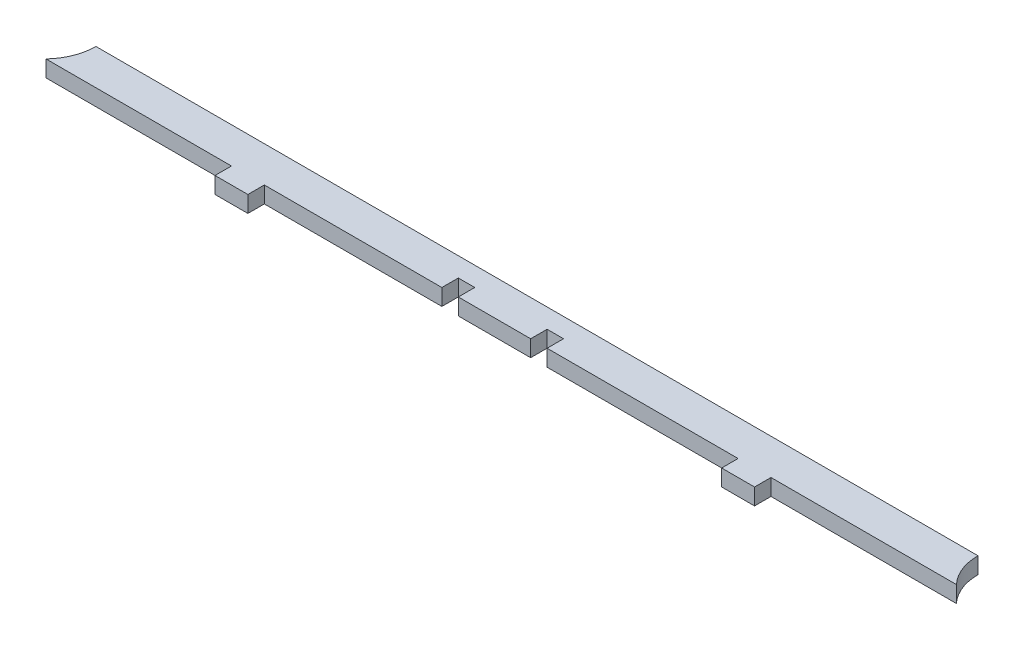
ISO-10303-21;
HEADER;
FILE_DESCRIPTION(('STEP AP214'),'2;1');
FILE_NAME('part.step','',(''),(''),'','','');
FILE_SCHEMA(('AUTOMOTIVE_DESIGN { 1 0 10303 214 1 1 1 1 }'));
ENDSEC;
DATA;
#1=APPLICATION_CONTEXT('core data for automotive mechanical design processes');
#2=APPLICATION_PROTOCOL_DEFINITION('international standard','automotive_design',2000,#1);
#3=PRODUCT_CONTEXT('',#1,'mechanical');
#4=PRODUCT('Part','Part','',(#3));
#5=PRODUCT_RELATED_PRODUCT_CATEGORY('part','',(#4));
#6=PRODUCT_DEFINITION_FORMATION('','',#4);
#7=PRODUCT_DEFINITION_CONTEXT('part definition',#1,'design');
#8=PRODUCT_DEFINITION('design','',#6,#7);
#9=PRODUCT_DEFINITION_SHAPE('','',#8);
#10=(LENGTH_UNIT() NAMED_UNIT(*) SI_UNIT(.MILLI.,.METRE.));
#11=(NAMED_UNIT(*) PLANE_ANGLE_UNIT() SI_UNIT($,.RADIAN.));
#12=(NAMED_UNIT(*) SI_UNIT($,.STERADIAN.) SOLID_ANGLE_UNIT());
#13=UNCERTAINTY_MEASURE_WITH_UNIT(LENGTH_MEASURE(1.E-05),#10,'distance_accuracy_value','');
#14=(GEOMETRIC_REPRESENTATION_CONTEXT(3) GLOBAL_UNCERTAINTY_ASSIGNED_CONTEXT((#13)) GLOBAL_UNIT_ASSIGNED_CONTEXT((#10,
#11,#12)) REPRESENTATION_CONTEXT('',''));
#15=CARTESIAN_POINT('',(0.,0.,0.));
#16=DIRECTION('',(0.,0.,1.));
#17=DIRECTION('',(1.,0.,0.));
#18=AXIS2_PLACEMENT_3D('',#15,#16,#17);
#19=CARTESIAN_POINT('',(0.,2.5,10.875));
#20=DIRECTION('',(0.,0.,1.));
#21=DIRECTION('',(1.,0.,0.));
#22=AXIS2_PLACEMENT_3D('',#19,#20,#21);
#23=PLANE('',#22);
#24=DIRECTION('',(0.,1.,0.));
#25=VECTOR('',#24,1.);
#26=CARTESIAN_POINT('',(13.9550335062204,-2.501,10.875));
#27=LINE('',#26,#25);
#28=CARTESIAN_POINT('',(13.9550335062204,-2.5,10.875));
#29=VERTEX_POINT('',#28);
#30=CARTESIAN_POINT('',(13.9550335062204,2.5,10.875));
#31=VERTEX_POINT('',#30);
#32=EDGE_CURVE('E212',#29,#31,#27,.T.);
#33=ORIENTED_EDGE('',*,*,#32,.F.);
#34=DIRECTION('',(-1.,0.,0.));
#35=VECTOR('',#34,1.);
#36=CARTESIAN_POINT('',(0.,-2.5,10.875));
#37=LINE('',#36,#35);
#38=CARTESIAN_POINT('',(72.04,-2.5,10.875));
#39=VERTEX_POINT('',#38);
#40=EDGE_CURVE('E273',#39,#29,#37,.T.);
#41=ORIENTED_EDGE('',*,*,#40,.F.);
#42=DIRECTION('',(0.,-1.,0.));
#43=VECTOR('',#42,1.);
#44=CARTESIAN_POINT('',(72.04,2.5,10.875));
#45=LINE('',#44,#43);
#46=CARTESIAN_POINT('',(72.04,2.5,10.875));
#47=VERTEX_POINT('',#46);
#48=EDGE_CURVE('E308',#47,#39,#45,.T.);
#49=ORIENTED_EDGE('',*,*,#48,.F.);
#50=DIRECTION('',(-1.,0.,0.));
#51=VECTOR('',#50,1.);
#52=CARTESIAN_POINT('',(0.,2.5,10.875));
#53=LINE('',#52,#51);
#54=EDGE_CURVE('E244',#47,#31,#53,.T.);
#55=ORIENTED_EDGE('',*,*,#54,.T.);
#56=EDGE_LOOP('',(#33,#41,#49,#55));
#57=FACE_BOUND('',#56,.T.);
#58=ADVANCED_FACE('F41',(#57),#23,.T.);
#59=DIRECTION('',(0.,1.,0.));
#60=VECTOR('',#59,1.);
#61=CARTESIAN_POINT('',(8.95503350622037,-2.501,10.875));
#62=LINE('',#61,#60);
#63=CARTESIAN_POINT('',(8.95503350622037,-2.5,10.875));
#64=VERTEX_POINT('',#63);
#65=CARTESIAN_POINT('',(8.95503350622037,2.5,10.875));
#66=VERTEX_POINT('',#65);
#67=EDGE_CURVE('E64',#64,#66,#62,.T.);
#68=ORIENTED_EDGE('',*,*,#67,.T.);
#69=CARTESIAN_POINT('',(-13.0449664937796,2.5,10.875));
#70=VERTEX_POINT('',#69);
#71=EDGE_CURVE('E432',#66,#70,#53,.T.);
#72=ORIENTED_EDGE('',*,*,#71,.T.);
#73=DIRECTION('',(0.,1.,0.));
#74=VECTOR('',#73,1.);
#75=CARTESIAN_POINT('',(-13.0449664937796,-2.501,10.875));
#76=LINE('',#75,#74);
#77=CARTESIAN_POINT('',(-13.0449664937796,-2.5,10.875));
#78=VERTEX_POINT('',#77);
#79=EDGE_CURVE('E219',#78,#70,#76,.T.);
#80=ORIENTED_EDGE('',*,*,#79,.F.);
#81=EDGE_CURVE('E344',#64,#78,#37,.T.);
#82=ORIENTED_EDGE('',*,*,#81,.F.);
#83=EDGE_LOOP('',(#68,#72,#80,#82));
#84=FACE_BOUND('',#83,.T.);
#85=ADVANCED_FACE('F374',(#84),#23,.T.);
#86=CARTESIAN_POINT('',(-18.0449664937796,-2.5,10.875));
#87=VERTEX_POINT('',#86);
#88=CARTESIAN_POINT('',(-72.04,-2.5,10.875));
#89=VERTEX_POINT('',#88);
#90=EDGE_CURVE('E272',#87,#89,#37,.T.);
#91=ORIENTED_EDGE('',*,*,#90,.F.);
#92=DIRECTION('',(0.,1.,0.));
#93=VECTOR('',#92,1.);
#94=CARTESIAN_POINT('',(-18.0449664937796,-2.501,10.875));
#95=LINE('',#94,#93);
#96=CARTESIAN_POINT('',(-18.0449664937796,2.5,10.875));
#97=VERTEX_POINT('',#96);
#98=EDGE_CURVE('E56',#87,#97,#95,.T.);
#99=ORIENTED_EDGE('',*,*,#98,.T.);
#100=CARTESIAN_POINT('',(-72.04,2.5,10.875));
#101=VERTEX_POINT('',#100);
#102=EDGE_CURVE('E243',#97,#101,#53,.T.);
#103=ORIENTED_EDGE('',*,*,#102,.T.);
#104=DIRECTION('',(0.,-1.,0.));
#105=VECTOR('',#104,1.);
#106=CARTESIAN_POINT('',(-72.04,2.5,10.875));
#107=LINE('',#106,#105);
#108=EDGE_CURVE('E310',#101,#89,#107,.T.);
#109=ORIENTED_EDGE('',*,*,#108,.T.);
#110=EDGE_LOOP('',(#91,#99,#103,#109));
#111=FACE_BOUND('',#110,.T.);
#112=ADVANCED_FACE('F349',(#111),#23,.T.);
#113=CARTESIAN_POINT('',(0.,2.5,0.));
#114=DIRECTION('',(0.,1.,0.));
#115=DIRECTION('',(0.,0.,1.));
#116=AXIS2_PLACEMENT_3D('',#113,#114,#115);
#117=PLANE('',#116);
#118=DIRECTION('',(0.,0.,-1.));
#119=VECTOR('',#118,1.);
#120=CARTESIAN_POINT('',(13.9550335062204,2.5,10.875));
#121=LINE('',#120,#119);
#122=CARTESIAN_POINT('',(13.9550335062204,2.5,5.87500000000002));
#123=VERTEX_POINT('',#122);
#124=EDGE_CURVE('E186',#31,#123,#121,.T.);
#125=ORIENTED_EDGE('',*,*,#124,.F.);
#126=ORIENTED_EDGE('',*,*,#54,.F.);
#127=DIRECTION('',(0.,0.,1.));
#128=VECTOR('',#127,1.);
#129=CARTESIAN_POINT('',(72.04,2.5,0.));
#130=LINE('',#129,#128);
#131=CARTESIAN_POINT('',(72.04,2.5,15.875));
#132=VERTEX_POINT('',#131);
#133=EDGE_CURVE('E252',#47,#132,#130,.T.);
#134=ORIENTED_EDGE('',*,*,#133,.T.);
#135=DIRECTION('',(1.,0.,0.));
#136=VECTOR('',#135,1.);
#137=CARTESIAN_POINT('',(0.,2.5,15.875));
#138=LINE('',#137,#136);
#139=CARTESIAN_POINT('',(82.04,2.5,15.875));
#140=VERTEX_POINT('',#139);
#141=EDGE_CURVE('E254',#132,#140,#138,.T.);
#142=ORIENTED_EDGE('',*,*,#141,.T.);
#143=DIRECTION('',(0.,0.,1.));
#144=VECTOR('',#143,1.);
#145=CARTESIAN_POINT('',(82.04,2.5,0.));
#146=LINE('',#145,#144);
#147=CARTESIAN_POINT('',(82.04,2.5,10.875));
#148=VERTEX_POINT('',#147);
#149=EDGE_CURVE('E256',#148,#140,#146,.T.);
#150=ORIENTED_EDGE('',*,*,#149,.F.);
#151=CARTESIAN_POINT('',(138.43496649378,2.5,10.875));
#152=VERTEX_POINT('',#151);
#153=EDGE_CURVE('E259',#152,#148,#53,.T.);
#154=ORIENTED_EDGE('',*,*,#153,.F.);
#155=CARTESIAN_POINT('',(150.,2.5,0.));
#156=DIRECTION('',(0.,1.,0.));
#157=DIRECTION('',(0.,0.,1.));
#158=AXIS2_PLACEMENT_3D('',#155,#156,#157);
#159=CIRCLE('',#158,15.875);
#160=CARTESIAN_POINT('',(134.125,2.5,0.));
#161=VERTEX_POINT('',#160);
#162=EDGE_CURVE('E260',#161,#152,#159,.T.);
#163=ORIENTED_EDGE('',*,*,#162,.F.);
#164=DIRECTION('',(-1.,0.,0.));
#165=VECTOR('',#164,1.);
#166=CARTESIAN_POINT('',(0.,2.5,0.));
#167=LINE('',#166,#165);
#168=CARTESIAN_POINT('',(-134.125,2.5,0.));
#169=VERTEX_POINT('',#168);
#170=EDGE_CURVE('E263',#161,#169,#167,.T.);
#171=ORIENTED_EDGE('',*,*,#170,.T.);
#172=CARTESIAN_POINT('',(-150.,2.5,0.));
#173=DIRECTION('',(0.,1.,0.));
#174=DIRECTION('',(0.,0.,1.));
#175=AXIS2_PLACEMENT_3D('',#172,#173,#174);
#176=CIRCLE('',#175,15.875);
#177=CARTESIAN_POINT('',(-138.43496649378,2.5,10.8750000000001));
#178=VERTEX_POINT('',#177);
#179=EDGE_CURVE('E235',#178,#169,#176,.T.);
#180=ORIENTED_EDGE('',*,*,#179,.F.);
#181=CARTESIAN_POINT('',(-82.04,2.5,10.875));
#182=VERTEX_POINT('',#181);
#183=EDGE_CURVE('E238',#182,#178,#53,.T.);
#184=ORIENTED_EDGE('',*,*,#183,.F.);
#185=DIRECTION('',(0.,0.,1.));
#186=VECTOR('',#185,1.);
#187=CARTESIAN_POINT('',(-82.04,2.5,0.));
#188=LINE('',#187,#186);
#189=CARTESIAN_POINT('',(-82.04,2.5,15.875));
#190=VERTEX_POINT('',#189);
#191=EDGE_CURVE('E242',#182,#190,#188,.T.);
#192=ORIENTED_EDGE('',*,*,#191,.T.);
#193=DIRECTION('',(-1.,0.,0.));
#194=VECTOR('',#193,1.);
#195=CARTESIAN_POINT('',(0.,2.5,15.875));
#196=LINE('',#195,#194);
#197=CARTESIAN_POINT('',(-72.04,2.5,15.875));
#198=VERTEX_POINT('',#197);
#199=EDGE_CURVE('E246',#198,#190,#196,.T.);
#200=ORIENTED_EDGE('',*,*,#199,.F.);
#201=DIRECTION('',(0.,0.,1.));
#202=VECTOR('',#201,1.);
#203=CARTESIAN_POINT('',(-72.04,2.5,-1.99951166734991E-13));
#204=LINE('',#203,#202);
#205=EDGE_CURVE('E249',#101,#198,#204,.T.);
#206=ORIENTED_EDGE('',*,*,#205,.F.);
#207=ORIENTED_EDGE('',*,*,#102,.F.);
#208=DIRECTION('',(0.,0.,-1.));
#209=VECTOR('',#208,1.);
#210=CARTESIAN_POINT('',(-18.0449664937796,2.5,10.875));
#211=LINE('',#210,#209);
#212=CARTESIAN_POINT('',(-18.0449664937796,2.5,5.87500000000002));
#213=VERTEX_POINT('',#212);
#214=EDGE_CURVE('E224',#97,#213,#211,.T.);
#215=ORIENTED_EDGE('',*,*,#214,.T.);
#216=DIRECTION('',(1.,0.,0.));
#217=VECTOR('',#216,1.);
#218=CARTESIAN_POINT('',(-18.0449664937796,2.5,5.87500000000002));
#219=LINE('',#218,#217);
#220=CARTESIAN_POINT('',(-13.0449664937796,2.5,5.87500000000002));
#221=VERTEX_POINT('',#220);
#222=EDGE_CURVE('E230',#213,#221,#219,.T.);
#223=ORIENTED_EDGE('',*,*,#222,.T.);
#224=DIRECTION('',(0.,0.,1.));
#225=VECTOR('',#224,1.);
#226=CARTESIAN_POINT('',(-13.0449664937796,2.5,5.87500000000002));
#227=LINE('',#226,#225);
#228=EDGE_CURVE('E227',#221,#70,#227,.T.);
#229=ORIENTED_EDGE('',*,*,#228,.T.);
#230=ORIENTED_EDGE('',*,*,#71,.F.);
#231=DIRECTION('',(0.,0.,1.));
#232=VECTOR('',#231,1.);
#233=CARTESIAN_POINT('',(8.95503350622037,2.5,5.87500000000002));
#234=LINE('',#233,#232);
#235=CARTESIAN_POINT('',(8.95503350622037,2.5,5.87500000000002));
#236=VERTEX_POINT('',#235);
#237=EDGE_CURVE('E207',#236,#66,#234,.T.);
#238=ORIENTED_EDGE('',*,*,#237,.F.);
#239=DIRECTION('',(-1.,0.,0.));
#240=VECTOR('',#239,1.);
#241=CARTESIAN_POINT('',(13.9550335062204,2.5,5.87500000000002));
#242=LINE('',#241,#240);
#243=EDGE_CURVE('E184',#123,#236,#242,.T.);
#244=ORIENTED_EDGE('',*,*,#243,.F.);
#245=EDGE_LOOP('',(#125,#126,#134,#142,#150,#154,#163,#171,#180,#184,#192,#200,#206,#207,#215,
#223,#229,#230,#238,#244));
#246=FACE_BOUND('',#245,.T.);
#247=ADVANCED_FACE('F359',(#246),#117,.T.);
#248=CARTESIAN_POINT('',(0.,-2.5,0.));
#249=DIRECTION('',(0.,1.,0.));
#250=DIRECTION('',(0.,0.,1.));
#251=AXIS2_PLACEMENT_3D('',#248,#249,#250);
#252=PLANE('',#251);
#253=ORIENTED_EDGE('',*,*,#40,.T.);
#254=DIRECTION('',(0.,0.,1.));
#255=VECTOR('',#254,1.);
#256=CARTESIAN_POINT('',(13.9550335062204,-2.5,10.875));
#257=LINE('',#256,#255);
#258=CARTESIAN_POINT('',(13.9550335062204,-2.5,5.87500000000002));
#259=VERTEX_POINT('',#258);
#260=EDGE_CURVE('E198',#259,#29,#257,.T.);
#261=ORIENTED_EDGE('',*,*,#260,.F.);
#262=DIRECTION('',(1.,0.,0.));
#263=VECTOR('',#262,1.);
#264=CARTESIAN_POINT('',(13.9550335062204,-2.5,5.87500000000002));
#265=LINE('',#264,#263);
#266=CARTESIAN_POINT('',(8.95503350622037,-2.5,5.87500000000002));
#267=VERTEX_POINT('',#266);
#268=EDGE_CURVE('E181',#267,#259,#265,.T.);
#269=ORIENTED_EDGE('',*,*,#268,.F.);
#270=DIRECTION('',(0.,0.,-1.));
#271=VECTOR('',#270,1.);
#272=CARTESIAN_POINT('',(8.95503350622037,-2.5,5.87500000000002));
#273=LINE('',#272,#271);
#274=EDGE_CURVE('E188',#64,#267,#273,.T.);
#275=ORIENTED_EDGE('',*,*,#274,.F.);
#276=ORIENTED_EDGE('',*,*,#81,.T.);
#277=DIRECTION('',(0.,0.,-1.));
#278=VECTOR('',#277,1.);
#279=CARTESIAN_POINT('',(-13.0449664937796,-2.5,5.87500000000002));
#280=LINE('',#279,#278);
#281=CARTESIAN_POINT('',(-13.0449664937796,-2.5,5.87500000000002));
#282=VERTEX_POINT('',#281);
#283=EDGE_CURVE('E203',#78,#282,#280,.T.);
#284=ORIENTED_EDGE('',*,*,#283,.T.);
#285=DIRECTION('',(-1.,0.,0.));
#286=VECTOR('',#285,1.);
#287=CARTESIAN_POINT('',(-18.0449664937796,-2.5,5.87500000000002));
#288=LINE('',#287,#286);
#289=CARTESIAN_POINT('',(-18.0449664937796,-2.5,5.87500000000002));
#290=VERTEX_POINT('',#289);
#291=EDGE_CURVE('E199',#282,#290,#288,.T.);
#292=ORIENTED_EDGE('',*,*,#291,.T.);
#293=DIRECTION('',(0.,0.,1.));
#294=VECTOR('',#293,1.);
#295=CARTESIAN_POINT('',(-18.0449664937796,-2.5,10.875));
#296=LINE('',#295,#294);
#297=EDGE_CURVE('E215',#290,#87,#296,.T.);
#298=ORIENTED_EDGE('',*,*,#297,.T.);
#299=ORIENTED_EDGE('',*,*,#90,.T.);
#300=DIRECTION('',(0.,0.,1.));
#301=VECTOR('',#300,1.);
#302=CARTESIAN_POINT('',(-72.04,-2.5,-1.99951166734991E-13));
#303=LINE('',#302,#301);
#304=CARTESIAN_POINT('',(-72.04,-2.5,15.875));
#305=VERTEX_POINT('',#304);
#306=EDGE_CURVE('E279',#89,#305,#303,.T.);
#307=ORIENTED_EDGE('',*,*,#306,.T.);
#308=DIRECTION('',(-1.,0.,0.));
#309=VECTOR('',#308,1.);
#310=CARTESIAN_POINT('',(0.,-2.5,15.875));
#311=LINE('',#310,#309);
#312=CARTESIAN_POINT('',(-82.04,-2.5,15.875));
#313=VERTEX_POINT('',#312);
#314=EDGE_CURVE('E276',#305,#313,#311,.T.);
#315=ORIENTED_EDGE('',*,*,#314,.T.);
#316=DIRECTION('',(0.,0.,1.));
#317=VECTOR('',#316,1.);
#318=CARTESIAN_POINT('',(-82.04,-2.5,0.));
#319=LINE('',#318,#317);
#320=CARTESIAN_POINT('',(-82.04,-2.5,10.875));
#321=VERTEX_POINT('',#320);
#322=EDGE_CURVE('E271',#321,#313,#319,.T.);
#323=ORIENTED_EDGE('',*,*,#322,.F.);
#324=CARTESIAN_POINT('',(-138.43496649378,-2.5,10.8750000000001));
#325=VERTEX_POINT('',#324);
#326=EDGE_CURVE('E268',#321,#325,#37,.T.);
#327=ORIENTED_EDGE('',*,*,#326,.T.);
#328=CARTESIAN_POINT('',(-150.,-2.5,0.));
#329=DIRECTION('',(0.,1.,0.));
#330=DIRECTION('',(0.,0.,1.));
#331=AXIS2_PLACEMENT_3D('',#328,#329,#330);
#332=CIRCLE('',#331,15.875);
#333=CARTESIAN_POINT('',(-134.125,-2.5,0.));
#334=VERTEX_POINT('',#333);
#335=EDGE_CURVE('E193',#325,#334,#332,.T.);
#336=ORIENTED_EDGE('',*,*,#335,.T.);
#337=DIRECTION('',(-1.,0.,0.));
#338=VECTOR('',#337,1.);
#339=CARTESIAN_POINT('',(0.,-2.5,0.));
#340=LINE('',#339,#338);
#341=CARTESIAN_POINT('',(134.125,-2.5,0.));
#342=VERTEX_POINT('',#341);
#343=EDGE_CURVE('E239',#342,#334,#340,.T.);
#344=ORIENTED_EDGE('',*,*,#343,.F.);
#345=CARTESIAN_POINT('',(150.,-2.5,0.));
#346=DIRECTION('',(0.,1.,0.));
#347=DIRECTION('',(0.,0.,1.));
#348=AXIS2_PLACEMENT_3D('',#345,#346,#347);
#349=CIRCLE('',#348,15.875);
#350=CARTESIAN_POINT('',(138.43496649378,-2.5,10.875));
#351=VERTEX_POINT('',#350);
#352=EDGE_CURVE('E291',#342,#351,#349,.T.);
#353=ORIENTED_EDGE('',*,*,#352,.T.);
#354=CARTESIAN_POINT('',(82.04,-2.5,10.875));
#355=VERTEX_POINT('',#354);
#356=EDGE_CURVE('E290',#351,#355,#37,.T.);
#357=ORIENTED_EDGE('',*,*,#356,.T.);
#358=DIRECTION('',(0.,0.,1.));
#359=VECTOR('',#358,1.);
#360=CARTESIAN_POINT('',(82.04,-2.5,0.));
#361=LINE('',#360,#359);
#362=CARTESIAN_POINT('',(82.04,-2.5,15.875));
#363=VERTEX_POINT('',#362);
#364=EDGE_CURVE('E287',#355,#363,#361,.T.);
#365=ORIENTED_EDGE('',*,*,#364,.T.);
#366=DIRECTION('',(1.,0.,0.));
#367=VECTOR('',#366,1.);
#368=CARTESIAN_POINT('',(0.,-2.5,15.875));
#369=LINE('',#368,#367);
#370=CARTESIAN_POINT('',(72.04,-2.5,15.875));
#371=VERTEX_POINT('',#370);
#372=EDGE_CURVE('E284',#371,#363,#369,.T.);
#373=ORIENTED_EDGE('',*,*,#372,.F.);
#374=DIRECTION('',(0.,0.,1.));
#375=VECTOR('',#374,1.);
#376=CARTESIAN_POINT('',(72.04,-2.5,0.));
#377=LINE('',#376,#375);
#378=EDGE_CURVE('E282',#39,#371,#377,.T.);
#379=ORIENTED_EDGE('',*,*,#378,.F.);
#380=EDGE_LOOP('',(#253,#261,#269,#275,#276,#284,#292,#298,#299,#307,#315,#323,#327,#336,#344,
#353,#357,#365,#373,#379));
#381=FACE_BOUND('',#380,.T.);
#382=ADVANCED_FACE('F197',(#381),#252,.F.);
#383=CARTESIAN_POINT('',(-150.,2.5,0.));
#384=DIRECTION('',(0.,-1.,0.));
#385=DIRECTION('',(0.,0.,-1.));
#386=AXIS2_PLACEMENT_3D('',#383,#384,#385);
#387=CYLINDRICAL_SURFACE('',#386,15.875);
#388=ORIENTED_EDGE('',*,*,#335,.F.);
#389=DIRECTION('',(0.,-1.,0.));
#390=VECTOR('',#389,1.);
#391=CARTESIAN_POINT('',(-138.43496649378,2.5,10.8750000000001));
#392=LINE('',#391,#390);
#393=EDGE_CURVE('E11',#178,#325,#392,.T.);
#394=ORIENTED_EDGE('',*,*,#393,.F.);
#395=ORIENTED_EDGE('',*,*,#179,.T.);
#396=DIRECTION('',(0.,-1.,0.));
#397=VECTOR('',#396,1.);
#398=CARTESIAN_POINT('',(-134.125,2.5,0.));
#399=LINE('',#398,#397);
#400=EDGE_CURVE('E265',#169,#334,#399,.T.);
#401=ORIENTED_EDGE('',*,*,#400,.T.);
#402=EDGE_LOOP('',(#388,#394,#395,#401));
#403=FACE_BOUND('',#402,.T.);
#404=ADVANCED_FACE('F43',(#403),#387,.F.);
#405=ORIENTED_EDGE('',*,*,#326,.F.);
#406=DIRECTION('',(0.,-1.,0.));
#407=VECTOR('',#406,1.);
#408=CARTESIAN_POINT('',(-82.04,2.5,10.875));
#409=LINE('',#408,#407);
#410=EDGE_CURVE('E49',#182,#321,#409,.T.);
#411=ORIENTED_EDGE('',*,*,#410,.F.);
#412=ORIENTED_EDGE('',*,*,#183,.T.);
#413=ORIENTED_EDGE('',*,*,#393,.T.);
#414=EDGE_LOOP('',(#405,#411,#412,#413));
#415=FACE_BOUND('',#414,.T.);
#416=ADVANCED_FACE('F325',(#415),#23,.T.);
#417=CARTESIAN_POINT('',(-82.04,2.5,0.));
#418=DIRECTION('',(1.,0.,0.));
#419=DIRECTION('',(0.,0.,-1.));
#420=AXIS2_PLACEMENT_3D('',#417,#418,#419);
#421=PLANE('',#420);
#422=ORIENTED_EDGE('',*,*,#322,.T.);
#423=DIRECTION('',(0.,-1.,0.));
#424=VECTOR('',#423,1.);
#425=CARTESIAN_POINT('',(-82.04,2.5,15.875));
#426=LINE('',#425,#424);
#427=EDGE_CURVE('E315',#190,#313,#426,.T.);
#428=ORIENTED_EDGE('',*,*,#427,.F.);
#429=ORIENTED_EDGE('',*,*,#191,.F.);
#430=ORIENTED_EDGE('',*,*,#410,.T.);
#431=EDGE_LOOP('',(#422,#428,#429,#430));
#432=FACE_BOUND('',#431,.T.);
#433=ADVANCED_FACE('F319',(#432),#421,.F.);
#434=CARTESIAN_POINT('',(0.,2.5,15.875));
#435=DIRECTION('',(0.,0.,1.));
#436=DIRECTION('',(1.,0.,0.));
#437=AXIS2_PLACEMENT_3D('',#434,#435,#436);
#438=PLANE('',#437);
#439=ORIENTED_EDGE('',*,*,#314,.F.);
#440=DIRECTION('',(0.,-1.,0.));
#441=VECTOR('',#440,1.);
#442=CARTESIAN_POINT('',(-72.04,2.5,15.875));
#443=LINE('',#442,#441);
#444=EDGE_CURVE('E313',#198,#305,#443,.T.);
#445=ORIENTED_EDGE('',*,*,#444,.F.);
#446=ORIENTED_EDGE('',*,*,#199,.T.);
#447=ORIENTED_EDGE('',*,*,#427,.T.);
#448=EDGE_LOOP('',(#439,#445,#446,#447));
#449=FACE_BOUND('',#448,.T.);
#450=ADVANCED_FACE('F356',(#449),#438,.T.);
#451=CARTESIAN_POINT('',(-72.04,2.5,-1.99951166734991E-13));
#452=DIRECTION('',(1.,0.,0.));
#453=DIRECTION('',(0.,0.,-1.));
#454=AXIS2_PLACEMENT_3D('',#451,#452,#453);
#455=PLANE('',#454);
#456=ORIENTED_EDGE('',*,*,#306,.F.);
#457=ORIENTED_EDGE('',*,*,#108,.F.);
#458=ORIENTED_EDGE('',*,*,#205,.T.);
#459=ORIENTED_EDGE('',*,*,#444,.T.);
#460=EDGE_LOOP('',(#456,#457,#458,#459));
#461=FACE_BOUND('',#460,.T.);
#462=ADVANCED_FACE('F353',(#461),#455,.T.);
#463=CARTESIAN_POINT('',(72.04,2.5,0.));
#464=DIRECTION('',(1.,0.,0.));
#465=DIRECTION('',(0.,0.,-1.));
#466=AXIS2_PLACEMENT_3D('',#463,#464,#465);
#467=PLANE('',#466);
#468=ORIENTED_EDGE('',*,*,#378,.T.);
#469=DIRECTION('',(0.,-1.,0.));
#470=VECTOR('',#469,1.);
#471=CARTESIAN_POINT('',(72.04,2.5,15.875));
#472=LINE('',#471,#470);
#473=EDGE_CURVE('E305',#132,#371,#472,.T.);
#474=ORIENTED_EDGE('',*,*,#473,.F.);
#475=ORIENTED_EDGE('',*,*,#133,.F.);
#476=ORIENTED_EDGE('',*,*,#48,.T.);
#477=EDGE_LOOP('',(#468,#474,#475,#476));
#478=FACE_BOUND('',#477,.T.);
#479=ADVANCED_FACE('F426',(#478),#467,.F.);
#480=CARTESIAN_POINT('',(0.,2.5,15.875));
#481=DIRECTION('',(0.,0.,-1.));
#482=DIRECTION('',(-1.,0.,0.));
#483=AXIS2_PLACEMENT_3D('',#480,#481,#482);
#484=PLANE('',#483);
#485=ORIENTED_EDGE('',*,*,#372,.T.);
#486=DIRECTION('',(0.,-1.,0.));
#487=VECTOR('',#486,1.);
#488=CARTESIAN_POINT('',(82.04,2.5,15.875));
#489=LINE('',#488,#487);
#490=EDGE_CURVE('E303',#140,#363,#489,.T.);
#491=ORIENTED_EDGE('',*,*,#490,.F.);
#492=ORIENTED_EDGE('',*,*,#141,.F.);
#493=ORIENTED_EDGE('',*,*,#473,.T.);
#494=EDGE_LOOP('',(#485,#491,#492,#493));
#495=FACE_BOUND('',#494,.T.);
#496=ADVANCED_FACE('F388',(#495),#484,.F.);
#497=CARTESIAN_POINT('',(82.04,2.5,0.));
#498=DIRECTION('',(1.,0.,0.));
#499=DIRECTION('',(0.,0.,-1.));
#500=AXIS2_PLACEMENT_3D('',#497,#498,#499);
#501=PLANE('',#500);
#502=ORIENTED_EDGE('',*,*,#364,.F.);
#503=DIRECTION('',(0.,-1.,0.));
#504=VECTOR('',#503,1.);
#505=CARTESIAN_POINT('',(82.04,2.5,10.875));
#506=LINE('',#505,#504);
#507=EDGE_CURVE('E301',#148,#355,#506,.T.);
#508=ORIENTED_EDGE('',*,*,#507,.F.);
#509=ORIENTED_EDGE('',*,*,#149,.T.);
#510=ORIENTED_EDGE('',*,*,#490,.T.);
#511=EDGE_LOOP('',(#502,#508,#509,#510));
#512=FACE_BOUND('',#511,.T.);
#513=ADVANCED_FACE('F384',(#512),#501,.T.);
#514=ORIENTED_EDGE('',*,*,#356,.F.);
#515=DIRECTION('',(0.,-1.,0.));
#516=VECTOR('',#515,1.);
#517=CARTESIAN_POINT('',(138.43496649378,2.5,10.875));
#518=LINE('',#517,#516);
#519=EDGE_CURVE('E299',#152,#351,#518,.T.);
#520=ORIENTED_EDGE('',*,*,#519,.F.);
#521=ORIENTED_EDGE('',*,*,#153,.T.);
#522=ORIENTED_EDGE('',*,*,#507,.T.);
#523=EDGE_LOOP('',(#514,#520,#521,#522));
#524=FACE_BOUND('',#523,.T.);
#525=ADVANCED_FACE('F342',(#524),#23,.T.);
#526=CARTESIAN_POINT('',(150.,2.5,0.));
#527=DIRECTION('',(0.,-1.,0.));
#528=DIRECTION('',(0.,0.,-1.));
#529=AXIS2_PLACEMENT_3D('',#526,#527,#528);
#530=CYLINDRICAL_SURFACE('',#529,15.875);
#531=ORIENTED_EDGE('',*,*,#352,.F.);
#532=DIRECTION('',(0.,-1.,0.));
#533=VECTOR('',#532,1.);
#534=CARTESIAN_POINT('',(134.125,2.5,0.));
#535=LINE('',#534,#533);
#536=EDGE_CURVE('E297',#161,#342,#535,.T.);
#537=ORIENTED_EDGE('',*,*,#536,.F.);
#538=ORIENTED_EDGE('',*,*,#162,.T.);
#539=ORIENTED_EDGE('',*,*,#519,.T.);
#540=EDGE_LOOP('',(#531,#537,#538,#539));
#541=FACE_BOUND('',#540,.T.);
#542=ADVANCED_FACE('F335',(#541),#530,.F.);
#543=CARTESIAN_POINT('',(0.,2.5,0.));
#544=DIRECTION('',(0.,0.,1.));
#545=DIRECTION('',(1.,0.,0.));
#546=AXIS2_PLACEMENT_3D('',#543,#544,#545);
#547=PLANE('',#546);
#548=ORIENTED_EDGE('',*,*,#343,.T.);
#549=ORIENTED_EDGE('',*,*,#400,.F.);
#550=ORIENTED_EDGE('',*,*,#170,.F.);
#551=ORIENTED_EDGE('',*,*,#536,.T.);
#552=EDGE_LOOP('',(#548,#549,#550,#551));
#553=FACE_BOUND('',#552,.T.);
#554=ADVANCED_FACE('F360',(#553),#547,.F.);
#555=CARTESIAN_POINT('',(-18.0449664937796,-2.501,5.87500000000002));
#556=DIRECTION('',(0.,0.,1.));
#557=DIRECTION('',(1.,0.,0.));
#558=AXIS2_PLACEMENT_3D('',#555,#556,#557);
#559=PLANE('',#558);
#560=DIRECTION('',(0.,1.,0.));
#561=VECTOR('',#560,1.);
#562=CARTESIAN_POINT('',(-13.0449664937796,-2.501,5.87500000000002));
#563=LINE('',#562,#561);
#564=EDGE_CURVE('E217',#282,#221,#563,.T.);
#565=ORIENTED_EDGE('',*,*,#564,.T.);
#566=ORIENTED_EDGE('',*,*,#222,.F.);
#567=DIRECTION('',(0.,1.,0.));
#568=VECTOR('',#567,1.);
#569=CARTESIAN_POINT('',(-18.0449664937796,-2.501,5.87500000000002));
#570=LINE('',#569,#568);
#571=EDGE_CURVE('E222',#290,#213,#570,.T.);
#572=ORIENTED_EDGE('',*,*,#571,.F.);
#573=ORIENTED_EDGE('',*,*,#291,.F.);
#574=EDGE_LOOP('',(#565,#566,#572,#573));
#575=FACE_BOUND('',#574,.T.);
#576=ADVANCED_FACE('F362',(#575),#559,.T.);
#577=CARTESIAN_POINT('',(-13.0449664937796,-2.501,5.87500000000002));
#578=DIRECTION('',(-1.,0.,0.));
#579=DIRECTION('',(0.,0.,1.));
#580=AXIS2_PLACEMENT_3D('',#577,#578,#579);
#581=PLANE('',#580);
#582=ORIENTED_EDGE('',*,*,#79,.T.);
#583=ORIENTED_EDGE('',*,*,#228,.F.);
#584=ORIENTED_EDGE('',*,*,#564,.F.);
#585=ORIENTED_EDGE('',*,*,#283,.F.);
#586=EDGE_LOOP('',(#582,#583,#584,#585));
#587=FACE_BOUND('',#586,.T.);
#588=ADVANCED_FACE('F369',(#587),#581,.T.);
#589=CARTESIAN_POINT('',(-18.0449664937796,-2.501,10.875));
#590=DIRECTION('',(1.,0.,0.));
#591=DIRECTION('',(0.,0.,-1.));
#592=AXIS2_PLACEMENT_3D('',#589,#590,#591);
#593=PLANE('',#592);
#594=ORIENTED_EDGE('',*,*,#571,.T.);
#595=ORIENTED_EDGE('',*,*,#214,.F.);
#596=ORIENTED_EDGE('',*,*,#98,.F.);
#597=ORIENTED_EDGE('',*,*,#297,.F.);
#598=EDGE_LOOP('',(#594,#595,#596,#597));
#599=FACE_BOUND('',#598,.T.);
#600=ADVANCED_FACE('F404',(#599),#593,.T.);
#601=CARTESIAN_POINT('',(13.9550335062204,-2.501,5.87500000000002));
#602=DIRECTION('',(0.,0.,-1.));
#603=DIRECTION('',(-1.,0.,0.));
#604=AXIS2_PLACEMENT_3D('',#601,#602,#603);
#605=PLANE('',#604);
#606=ORIENTED_EDGE('',*,*,#268,.T.);
#607=DIRECTION('',(0.,1.,0.));
#608=VECTOR('',#607,1.);
#609=CARTESIAN_POINT('',(13.9550335062204,-2.501,5.87500000000002));
#610=LINE('',#609,#608);
#611=EDGE_CURVE('E194',#259,#123,#610,.T.);
#612=ORIENTED_EDGE('',*,*,#611,.T.);
#613=ORIENTED_EDGE('',*,*,#243,.T.);
#614=DIRECTION('',(0.,1.,0.));
#615=VECTOR('',#614,1.);
#616=CARTESIAN_POINT('',(8.95503350622037,-2.501,5.87500000000002));
#617=LINE('',#616,#615);
#618=EDGE_CURVE('E178',#267,#236,#617,.T.);
#619=ORIENTED_EDGE('',*,*,#618,.F.);
#620=EDGE_LOOP('',(#606,#612,#613,#619));
#621=FACE_BOUND('',#620,.T.);
#622=ADVANCED_FACE('F179',(#621),#605,.F.);
#623=CARTESIAN_POINT('',(13.9550335062204,-2.501,10.875));
#624=DIRECTION('',(1.,0.,0.));
#625=DIRECTION('',(0.,0.,-1.));
#626=AXIS2_PLACEMENT_3D('',#623,#624,#625);
#627=PLANE('',#626);
#628=ORIENTED_EDGE('',*,*,#260,.T.);
#629=ORIENTED_EDGE('',*,*,#32,.T.);
#630=ORIENTED_EDGE('',*,*,#124,.T.);
#631=ORIENTED_EDGE('',*,*,#611,.F.);
#632=EDGE_LOOP('',(#628,#629,#630,#631));
#633=FACE_BOUND('',#632,.T.);
#634=ADVANCED_FACE('F412',(#633),#627,.F.);
#635=CARTESIAN_POINT('',(8.95503350622037,-2.501,5.87500000000002));
#636=DIRECTION('',(-1.,0.,0.));
#637=DIRECTION('',(0.,0.,1.));
#638=AXIS2_PLACEMENT_3D('',#635,#636,#637);
#639=PLANE('',#638);
#640=ORIENTED_EDGE('',*,*,#274,.T.);
#641=ORIENTED_EDGE('',*,*,#618,.T.);
#642=ORIENTED_EDGE('',*,*,#237,.T.);
#643=ORIENTED_EDGE('',*,*,#67,.F.);
#644=EDGE_LOOP('',(#640,#641,#642,#643));
#645=FACE_BOUND('',#644,.T.);
#646=ADVANCED_FACE('F189',(#645),#639,.F.);
#647=CLOSED_SHELL('',(#58,#85,#112,#247,#382,#404,#416,#433,#450,#462,#479,#496,#513,#525,#542,
#554,#576,#588,#600,#622,#634,#646));
#648=MANIFOLD_SOLID_BREP('B2',#647);
#649=ADVANCED_BREP_SHAPE_REPRESENTATION('',(#18,#648),#14);
#650=SHAPE_DEFINITION_REPRESENTATION(#9,#649);
ENDSEC;
END-ISO-10303-21;
